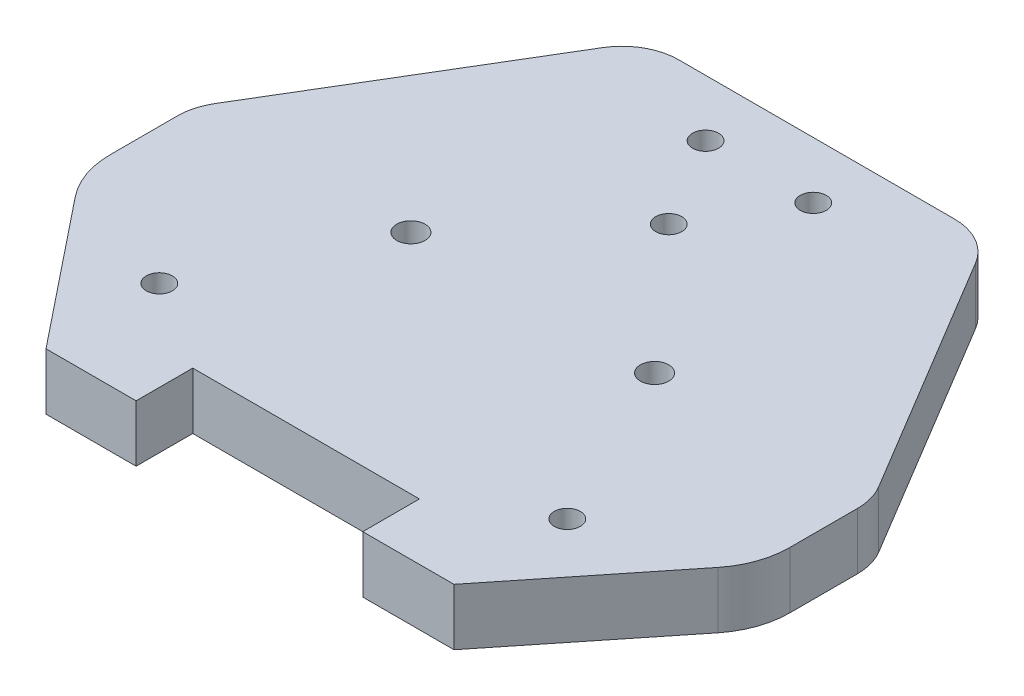
ISO-10303-21;
HEADER;
FILE_DESCRIPTION(('STEP AP214'),'2;1');
FILE_NAME('part.step','',(''),(''),'','','');
FILE_SCHEMA(('AUTOMOTIVE_DESIGN { 1 0 10303 214 1 1 1 1 }'));
ENDSEC;
DATA;
#1=APPLICATION_CONTEXT('core data for automotive mechanical design processes');
#2=APPLICATION_PROTOCOL_DEFINITION('international standard','automotive_design',2000,#1);
#3=PRODUCT_CONTEXT('',#1,'mechanical');
#4=PRODUCT('Part','Part','',(#3));
#5=PRODUCT_RELATED_PRODUCT_CATEGORY('part','',(#4));
#6=PRODUCT_DEFINITION_FORMATION('','',#4);
#7=PRODUCT_DEFINITION_CONTEXT('part definition',#1,'design');
#8=PRODUCT_DEFINITION('design','',#6,#7);
#9=PRODUCT_DEFINITION_SHAPE('','',#8);
#10=(LENGTH_UNIT() NAMED_UNIT(*) SI_UNIT(.MILLI.,.METRE.));
#11=(NAMED_UNIT(*) PLANE_ANGLE_UNIT() SI_UNIT($,.RADIAN.));
#12=(NAMED_UNIT(*) SI_UNIT($,.STERADIAN.) SOLID_ANGLE_UNIT());
#13=UNCERTAINTY_MEASURE_WITH_UNIT(LENGTH_MEASURE(1.E-05),#10,'distance_accuracy_value','');
#14=(GEOMETRIC_REPRESENTATION_CONTEXT(3) GLOBAL_UNCERTAINTY_ASSIGNED_CONTEXT((#13)) GLOBAL_UNIT_ASSIGNED_CONTEXT((#10,
#11,#12)) REPRESENTATION_CONTEXT('',''));
#15=CARTESIAN_POINT('',(0.,0.,0.));
#16=DIRECTION('',(0.,0.,1.));
#17=DIRECTION('',(1.,0.,0.));
#18=AXIS2_PLACEMENT_3D('',#15,#16,#17);
#19=CARTESIAN_POINT('',(0.,6.35,0.));
#20=DIRECTION('',(0.,1.,0.));
#21=DIRECTION('',(0.,0.,1.));
#22=AXIS2_PLACEMENT_3D('',#19,#20,#21);
#23=PLANE('',#22);
#24=CARTESIAN_POINT('',(19.685,6.35,-25.4));
#25=DIRECTION('',(0.,1.,0.));
#26=DIRECTION('',(0.,0.,1.));
#27=AXIS2_PLACEMENT_3D('',#24,#25,#26);
#28=CIRCLE('',#27,1.4605);
#29=CARTESIAN_POINT('',(19.685,6.35,-23.9395));
#30=VERTEX_POINT('',#29);
#31=EDGE_CURVE('E183',#30,#30,#28,.F.);
#32=ORIENTED_EDGE('',*,*,#31,.T.);
#33=EDGE_LOOP('',(#32));
#34=FACE_BOUND('',#33,.T.);
#35=CARTESIAN_POINT('',(7.62,6.35,-25.4));
#36=DIRECTION('',(0.,1.,0.));
#37=DIRECTION('',(0.,0.,1.));
#38=AXIS2_PLACEMENT_3D('',#35,#36,#37);
#39=CIRCLE('',#38,1.4605);
#40=CARTESIAN_POINT('',(7.62,6.35,-23.9395));
#41=VERTEX_POINT('',#40);
#42=EDGE_CURVE('E296',#41,#41,#39,.F.);
#43=ORIENTED_EDGE('',*,*,#42,.T.);
#44=EDGE_LOOP('',(#43));
#45=FACE_BOUND('',#44,.T.);
#46=CARTESIAN_POINT('',(13.6525,6.35,-15.24));
#47=DIRECTION('',(0.,1.,0.));
#48=DIRECTION('',(0.,0.,1.));
#49=AXIS2_PLACEMENT_3D('',#46,#47,#48);
#50=CIRCLE('',#49,1.4605);
#51=CARTESIAN_POINT('',(13.6525,6.35,-13.7795));
#52=VERTEX_POINT('',#51);
#53=EDGE_CURVE('E299',#52,#52,#50,.F.);
#54=ORIENTED_EDGE('',*,*,#53,.T.);
#55=EDGE_LOOP('',(#54));
#56=FACE_BOUND('',#55,.T.);
#57=CARTESIAN_POINT('',(-9.144,6.35,19.05));
#58=DIRECTION('',(0.,1.,0.));
#59=DIRECTION('',(0.,0.,1.));
#60=AXIS2_PLACEMENT_3D('',#57,#58,#59);
#61=CIRCLE('',#60,1.4605);
#62=CARTESIAN_POINT('',(-9.144,6.35,20.5105));
#63=VERTEX_POINT('',#62);
#64=EDGE_CURVE('E302',#63,#63,#61,.F.);
#65=ORIENTED_EDGE('',*,*,#64,.T.);
#66=EDGE_LOOP('',(#65));
#67=FACE_BOUND('',#66,.T.);
#68=CARTESIAN_POINT('',(36.576,6.35,19.05));
#69=DIRECTION('',(0.,1.,0.));
#70=DIRECTION('',(0.,0.,1.));
#71=AXIS2_PLACEMENT_3D('',#68,#69,#70);
#72=CIRCLE('',#71,1.4605);
#73=CARTESIAN_POINT('',(36.576,6.35,20.5105));
#74=VERTEX_POINT('',#73);
#75=EDGE_CURVE('E305',#74,#74,#72,.F.);
#76=ORIENTED_EDGE('',*,*,#75,.T.);
#77=EDGE_LOOP('',(#76));
#78=FACE_BOUND('',#77,.T.);
#79=CARTESIAN_POINT('',(27.305,6.35,0.));
#80=DIRECTION('',(0.,1.,0.));
#81=DIRECTION('',(0.,0.,1.));
#82=AXIS2_PLACEMENT_3D('',#79,#80,#81);
#83=CIRCLE('',#82,1.5875);
#84=CARTESIAN_POINT('',(27.305,6.35,1.5875));
#85=VERTEX_POINT('',#84);
#86=EDGE_CURVE('E308',#85,#85,#83,.F.);
#87=ORIENTED_EDGE('',*,*,#86,.T.);
#88=EDGE_LOOP('',(#87));
#89=FACE_BOUND('',#88,.T.);
#90=CARTESIAN_POINT('',(0.,6.35,0.));
#91=DIRECTION('',(0.,1.,0.));
#92=DIRECTION('',(0.,0.,1.));
#93=AXIS2_PLACEMENT_3D('',#90,#91,#92);
#94=CIRCLE('',#93,1.5875);
#95=CARTESIAN_POINT('',(0.,6.35,1.5875));
#96=VERTEX_POINT('',#95);
#97=EDGE_CURVE('E189',#96,#96,#94,.F.);
#98=ORIENTED_EDGE('',*,*,#97,.T.);
#99=EDGE_LOOP('',(#98));
#100=FACE_BOUND('',#99,.T.);
#101=DIRECTION('',(-1.,0.,0.));
#102=VECTOR('',#101,1.);
#103=CARTESIAN_POINT('',(26.3525,6.35,25.4));
#104=LINE('',#103,#102);
#105=CARTESIAN_POINT('',(0.952499999999997,6.35,25.4));
#106=VERTEX_POINT('',#105);
#107=CARTESIAN_POINT('',(26.3525,6.35,25.4));
#108=VERTEX_POINT('',#107);
#109=EDGE_CURVE('E190',#106,#108,#104,.F.);
#110=ORIENTED_EDGE('',*,*,#109,.T.);
#111=DIRECTION('',(0.,0.,-1.));
#112=VECTOR('',#111,1.);
#113=CARTESIAN_POINT('',(26.3525,6.35,31.75));
#114=LINE('',#113,#112);
#115=CARTESIAN_POINT('',(26.3525,6.35,31.75));
#116=VERTEX_POINT('',#115);
#117=EDGE_CURVE('E199',#108,#116,#114,.F.);
#118=ORIENTED_EDGE('',*,*,#117,.T.);
#119=DIRECTION('',(1.,0.,0.));
#120=VECTOR('',#119,1.);
#121=CARTESIAN_POINT('',(-9.144,6.35,31.75));
#122=LINE('',#121,#120);
#123=CARTESIAN_POINT('',(36.576,6.35,31.75));
#124=VERTEX_POINT('',#123);
#125=EDGE_CURVE('E155',#124,#116,#122,.F.);
#126=ORIENTED_EDGE('',*,*,#125,.F.);
#127=DIRECTION('',(0.624695047554424,0.,-0.78086880944303));
#128=VECTOR('',#127,1.);
#129=CARTESIAN_POINT('',(36.576,6.35,31.75));
#130=LINE('',#129,#128);
#131=CARTESIAN_POINT('',(49.7287754099449,6.35,15.3090307375689));
#132=VERTEX_POINT('',#131);
#133=EDGE_CURVE('E152',#132,#124,#130,.F.);
#134=ORIENTED_EDGE('',*,*,#133,.F.);
#135=CARTESIAN_POINT('',(42.291,6.35,9.35881040961303));
#136=DIRECTION('',(0.,-1.,0.));
#137=DIRECTION('',(0.,0.,-1.));
#138=AXIS2_PLACEMENT_3D('',#135,#136,#137);
#139=CIRCLE('',#138,9.525);
#140=CARTESIAN_POINT('',(51.816,6.35,9.35881040961303));
#141=VERTEX_POINT('',#140);
#142=EDGE_CURVE('E19',#141,#132,#139,.T.);
#143=ORIENTED_EDGE('',*,*,#142,.F.);
#144=DIRECTION('',(0.,0.,-1.));
#145=VECTOR('',#144,1.);
#146=CARTESIAN_POINT('',(51.816,6.35,12.7));
#147=LINE('',#146,#145);
#148=CARTESIAN_POINT('',(51.816,6.35,1.75884817742255));
#149=VERTEX_POINT('',#148);
#150=EDGE_CURVE('E137',#149,#141,#147,.F.);
#151=ORIENTED_EDGE('',*,*,#150,.F.);
#152=CARTESIAN_POINT('',(45.466,6.35,1.75884817742255));
#153=DIRECTION('',(0.,1.,0.));
#154=DIRECTION('',(0.,0.,1.));
#155=AXIS2_PLACEMENT_3D('',#152,#153,#154);
#156=CIRCLE('',#155,6.35);
#157=CARTESIAN_POINT('',(50.9110800782747,6.35,-1.50819986954225));
#158=VERTEX_POINT('',#157);
#159=EDGE_CURVE('E248',#158,#149,#156,.F.);
#160=ORIENTED_EDGE('',*,*,#159,.F.);
#161=DIRECTION('',(-0.514495755427526,0.,-0.857492925712544));
#162=VECTOR('',#161,1.);
#163=CARTESIAN_POINT('',(42.291,6.35,-15.875));
#164=LINE('',#163,#162);
#165=CARTESIAN_POINT('',(34.6157711718211,6.35,-28.6670480469648));
#166=VERTEX_POINT('',#165);
#167=EDGE_CURVE('E246',#166,#158,#164,.F.);
#168=ORIENTED_EDGE('',*,*,#167,.F.);
#169=CARTESIAN_POINT('',(29.1706910935465,6.35,-25.4));
#170=DIRECTION('',(0.,-1.,0.));
#171=DIRECTION('',(0.,0.,-1.));
#172=AXIS2_PLACEMENT_3D('',#169,#170,#171);
#173=CIRCLE('',#172,6.35);
#174=CARTESIAN_POINT('',(29.1706910935465,6.35,-31.75));
#175=VERTEX_POINT('',#174);
#176=EDGE_CURVE('E320',#175,#166,#173,.T.);
#177=ORIENTED_EDGE('',*,*,#176,.F.);
#178=DIRECTION('',(-1.,0.,0.));
#179=VECTOR('',#178,1.);
#180=CARTESIAN_POINT('',(51.816,6.35,-31.75));
#181=LINE('',#180,#179);
#182=CARTESIAN_POINT('',(-1.73869109354647,6.35,-31.75));
#183=VERTEX_POINT('',#182);
#184=EDGE_CURVE('E242',#183,#175,#181,.F.);
#185=ORIENTED_EDGE('',*,*,#184,.F.);
#186=CARTESIAN_POINT('',(-1.73869109354647,6.35,-25.4));
#187=DIRECTION('',(0.,1.,0.));
#188=DIRECTION('',(0.,0.,1.));
#189=AXIS2_PLACEMENT_3D('',#186,#187,#188);
#190=CIRCLE('',#189,6.35);
#191=CARTESIAN_POINT('',(-7.18377117182112,6.35,-28.6670480469648));
#192=VERTEX_POINT('',#191);
#193=EDGE_CURVE('E241',#192,#183,#190,.F.);
#194=ORIENTED_EDGE('',*,*,#193,.F.);
#195=DIRECTION('',(-0.514495755427527,0.,0.857492925712544));
#196=VECTOR('',#195,1.);
#197=CARTESIAN_POINT('',(-14.859,6.35,-15.875));
#198=LINE('',#197,#196);
#199=CARTESIAN_POINT('',(-23.4790800782747,6.35,-1.50819986954224));
#200=VERTEX_POINT('',#199);
#201=EDGE_CURVE('E238',#200,#192,#198,.F.);
#202=ORIENTED_EDGE('',*,*,#201,.F.);
#203=CARTESIAN_POINT('',(-18.034,6.35,1.75884817742255));
#204=DIRECTION('',(0.,-1.,0.));
#205=DIRECTION('',(0.,0.,-1.));
#206=AXIS2_PLACEMENT_3D('',#203,#204,#205);
#207=CIRCLE('',#206,6.35);
#208=CARTESIAN_POINT('',(-24.384,6.35,1.75884817742255));
#209=VERTEX_POINT('',#208);
#210=EDGE_CURVE('E315',#209,#200,#207,.T.);
#211=ORIENTED_EDGE('',*,*,#210,.F.);
#212=DIRECTION('',(0.,0.,1.));
#213=VECTOR('',#212,1.);
#214=CARTESIAN_POINT('',(-24.384,6.35,-31.75));
#215=LINE('',#214,#213);
#216=CARTESIAN_POINT('',(-24.384,6.35,9.31426121507454));
#217=VERTEX_POINT('',#216);
#218=EDGE_CURVE('E234',#217,#209,#215,.F.);
#219=ORIENTED_EDGE('',*,*,#218,.F.);
#220=CARTESIAN_POINT('',(-14.732,6.35,9.31426121507454));
#221=DIRECTION('',(0.,-1.,0.));
#222=DIRECTION('',(0.,0.,-1.));
#223=AXIS2_PLACEMENT_3D('',#220,#221,#222);
#224=CIRCLE('',#223,9.652);
#225=CARTESIAN_POINT('',(-22.2689457487441,6.35,15.3438178140698));
#226=VERTEX_POINT('',#225);
#227=EDGE_CURVE('E313',#226,#217,#224,.T.);
#228=ORIENTED_EDGE('',*,*,#227,.F.);
#229=DIRECTION('',(0.624695047554424,0.,0.78086880944303));
#230=VECTOR('',#229,1.);
#231=CARTESIAN_POINT('',(-24.384,6.35,12.7));
#232=LINE('',#231,#230);
#233=CARTESIAN_POINT('',(-9.144,6.35,31.75));
#234=VERTEX_POINT('',#233);
#235=EDGE_CURVE('E229',#234,#226,#232,.F.);
#236=ORIENTED_EDGE('',*,*,#235,.F.);
#237=DIRECTION('',(1.,0.,0.));
#238=VECTOR('',#237,1.);
#239=CARTESIAN_POINT('',(-9.144,6.35,31.75));
#240=LINE('',#239,#238);
#241=CARTESIAN_POINT('',(0.952499999999999,6.35,31.75));
#242=VERTEX_POINT('',#241);
#243=EDGE_CURVE('E224',#242,#234,#240,.F.);
#244=ORIENTED_EDGE('',*,*,#243,.F.);
#245=DIRECTION('',(0.,0.,1.));
#246=VECTOR('',#245,1.);
#247=CARTESIAN_POINT('',(0.9525,6.35,25.4));
#248=LINE('',#247,#246);
#249=EDGE_CURVE('E207',#242,#106,#248,.F.);
#250=ORIENTED_EDGE('',*,*,#249,.T.);
#251=EDGE_LOOP('',(#110,#118,#126,#134,#143,#151,#160,#168,#177,#185,#194,#202,#211,#219,#228,
#236,#244,#250));
#252=FACE_BOUND('',#251,.T.);
#253=ADVANCED_FACE('F16',(#34,#45,#56,#67,#78,#89,#100,#252),#23,.T.);
#254=CARTESIAN_POINT('',(26.3525,6.35,31.75));
#255=DIRECTION('',(1.,0.,0.));
#256=DIRECTION('',(0.,0.,-1.));
#257=AXIS2_PLACEMENT_3D('',#254,#255,#256);
#258=PLANE('',#257);
#259=ORIENTED_EDGE('',*,*,#117,.F.);
#260=DIRECTION('',(0.,1.,0.));
#261=VECTOR('',#260,1.);
#262=CARTESIAN_POINT('',(26.3525,6.35,25.4));
#263=LINE('',#262,#261);
#264=CARTESIAN_POINT('',(26.3525,0.,25.4));
#265=VERTEX_POINT('',#264);
#266=EDGE_CURVE('E186',#108,#265,#263,.F.);
#267=ORIENTED_EDGE('',*,*,#266,.T.);
#268=DIRECTION('',(0.,0.,1.));
#269=VECTOR('',#268,1.);
#270=CARTESIAN_POINT('',(26.3525,0.,0.));
#271=LINE('',#270,#269);
#272=CARTESIAN_POINT('',(26.3525,0.,31.75));
#273=VERTEX_POINT('',#272);
#274=EDGE_CURVE('E175',#265,#273,#271,.T.);
#275=ORIENTED_EDGE('',*,*,#274,.T.);
#276=DIRECTION('',(0.,1.,0.));
#277=VECTOR('',#276,1.);
#278=CARTESIAN_POINT('',(26.3525,0.,31.75));
#279=LINE('',#278,#277);
#280=EDGE_CURVE('E158',#116,#273,#279,.F.);
#281=ORIENTED_EDGE('',*,*,#280,.F.);
#282=EDGE_LOOP('',(#259,#267,#275,#281));
#283=FACE_BOUND('',#282,.T.);
#284=ADVANCED_FACE('F636',(#283),#258,.F.);
#285=CARTESIAN_POINT('',(-9.144,0.,31.75));
#286=DIRECTION('',(0.,0.,1.));
#287=DIRECTION('',(1.,0.,0.));
#288=AXIS2_PLACEMENT_3D('',#285,#286,#287);
#289=PLANE('',#288);
#290=ORIENTED_EDGE('',*,*,#125,.T.);
#291=ORIENTED_EDGE('',*,*,#280,.T.);
#292=DIRECTION('',(1.,0.,0.));
#293=VECTOR('',#292,1.);
#294=CARTESIAN_POINT('',(0.,0.,31.75));
#295=LINE('',#294,#293);
#296=CARTESIAN_POINT('',(36.576,0.,31.75));
#297=VERTEX_POINT('',#296);
#298=EDGE_CURVE('E172',#273,#297,#295,.T.);
#299=ORIENTED_EDGE('',*,*,#298,.T.);
#300=DIRECTION('',(0.,1.,0.));
#301=VECTOR('',#300,1.);
#302=CARTESIAN_POINT('',(36.576,0.,31.75));
#303=LINE('',#302,#301);
#304=EDGE_CURVE('E150',#124,#297,#303,.F.);
#305=ORIENTED_EDGE('',*,*,#304,.F.);
#306=EDGE_LOOP('',(#290,#291,#299,#305));
#307=FACE_BOUND('',#306,.T.);
#308=ADVANCED_FACE('F628',(#307),#289,.T.);
#309=CARTESIAN_POINT('',(36.576,0.,31.75));
#310=DIRECTION('',(0.78086880944303,0.,0.624695047554424));
#311=DIRECTION('',(0.624695047554424,0.,-0.78086880944303));
#312=AXIS2_PLACEMENT_3D('',#309,#310,#311);
#313=PLANE('',#312);
#314=DIRECTION('',(0.624695047554425,0.,-0.78086880944303));
#315=VECTOR('',#314,1.);
#316=CARTESIAN_POINT('',(36.576,0.,31.75));
#317=LINE('',#316,#315);
#318=CARTESIAN_POINT('',(49.7287754099449,0.,15.3090307375689));
#319=VERTEX_POINT('',#318);
#320=EDGE_CURVE('E163',#297,#319,#317,.T.);
#321=ORIENTED_EDGE('',*,*,#320,.T.);
#322=DIRECTION('',(0.,-1.,0.));
#323=VECTOR('',#322,1.);
#324=CARTESIAN_POINT('',(49.7287754099449,18.44548,15.3090307375689));
#325=LINE('',#324,#323);
#326=EDGE_CURVE('E146',#132,#319,#325,.T.);
#327=ORIENTED_EDGE('',*,*,#326,.F.);
#328=ORIENTED_EDGE('',*,*,#133,.T.);
#329=ORIENTED_EDGE('',*,*,#304,.T.);
#330=EDGE_LOOP('',(#321,#327,#328,#329));
#331=FACE_BOUND('',#330,.T.);
#332=ADVANCED_FACE('F161',(#331),#313,.T.);
#333=CARTESIAN_POINT('',(42.291,18.44548,9.35881040961303));
#334=DIRECTION('',(0.,-1.,0.));
#335=DIRECTION('',(0.,0.,-1.));
#336=AXIS2_PLACEMENT_3D('',#333,#334,#335);
#337=CYLINDRICAL_SURFACE('',#336,9.525);
#338=ORIENTED_EDGE('',*,*,#326,.T.);
#339=CARTESIAN_POINT('',(42.291,0.,9.35881040961303));
#340=DIRECTION('',(0.,-1.,0.));
#341=DIRECTION('',(0.,0.,-1.));
#342=AXIS2_PLACEMENT_3D('',#339,#340,#341);
#343=CIRCLE('',#342,9.525);
#344=CARTESIAN_POINT('',(51.816,0.,9.35881040961303));
#345=VERTEX_POINT('',#344);
#346=EDGE_CURVE('E292',#319,#345,#343,.F.);
#347=ORIENTED_EDGE('',*,*,#346,.T.);
#348=DIRECTION('',(0.,1.,0.));
#349=VECTOR('',#348,1.);
#350=CARTESIAN_POINT('',(51.816,0.,9.35881040961303));
#351=LINE('',#350,#349);
#352=EDGE_CURVE('E148',#141,#345,#351,.F.);
#353=ORIENTED_EDGE('',*,*,#352,.F.);
#354=ORIENTED_EDGE('',*,*,#142,.T.);
#355=EDGE_LOOP('',(#338,#347,#353,#354));
#356=FACE_BOUND('',#355,.T.);
#357=ADVANCED_FACE('F143',(#356),#337,.T.);
#358=CARTESIAN_POINT('',(51.816,0.,12.7));
#359=DIRECTION('',(1.,0.,0.));
#360=DIRECTION('',(0.,0.,-1.));
#361=AXIS2_PLACEMENT_3D('',#358,#359,#360);
#362=PLANE('',#361);
#363=DIRECTION('',(0.,0.,1.));
#364=VECTOR('',#363,1.);
#365=CARTESIAN_POINT('',(51.816,0.,0.));
#366=LINE('',#365,#364);
#367=CARTESIAN_POINT('',(51.816,0.,1.75884817742255));
#368=VERTEX_POINT('',#367);
#369=EDGE_CURVE('E291',#345,#368,#366,.F.);
#370=ORIENTED_EDGE('',*,*,#369,.T.);
#371=DIRECTION('',(0.,1.,0.));
#372=VECTOR('',#371,1.);
#373=CARTESIAN_POINT('',(51.816,-8.27786000000008,1.75884817742255));
#374=LINE('',#373,#372);
#375=EDGE_CURVE('E322',#149,#368,#374,.F.);
#376=ORIENTED_EDGE('',*,*,#375,.F.);
#377=ORIENTED_EDGE('',*,*,#150,.T.);
#378=ORIENTED_EDGE('',*,*,#352,.T.);
#379=EDGE_LOOP('',(#370,#376,#377,#378));
#380=FACE_BOUND('',#379,.T.);
#381=ADVANCED_FACE('F410',(#380),#362,.T.);
#382=CARTESIAN_POINT('',(45.466,-8.27786000000008,1.75884817742255));
#383=DIRECTION('',(0.,1.,0.));
#384=DIRECTION('',(0.,0.,1.));
#385=AXIS2_PLACEMENT_3D('',#382,#383,#384);
#386=CYLINDRICAL_SURFACE('',#385,6.35);
#387=DIRECTION('',(0.,1.,0.));
#388=VECTOR('',#387,1.);
#389=CARTESIAN_POINT('',(50.9110800782747,3.17499999999994,-1.50819986954225));
#390=LINE('',#389,#388);
#391=CARTESIAN_POINT('',(50.9110800782747,0.,-1.50819986954224));
#392=VERTEX_POINT('',#391);
#393=EDGE_CURVE('E247',#158,#392,#390,.F.);
#394=ORIENTED_EDGE('',*,*,#393,.F.);
#395=ORIENTED_EDGE('',*,*,#159,.T.);
#396=ORIENTED_EDGE('',*,*,#375,.T.);
#397=CARTESIAN_POINT('',(45.466,0.,1.75884817742255));
#398=DIRECTION('',(0.,1.,0.));
#399=DIRECTION('',(0.,0.,1.));
#400=AXIS2_PLACEMENT_3D('',#397,#398,#399);
#401=CIRCLE('',#400,6.35);
#402=EDGE_CURVE('E288',#368,#392,#401,.T.);
#403=ORIENTED_EDGE('',*,*,#402,.T.);
#404=EDGE_LOOP('',(#394,#395,#396,#403));
#405=FACE_BOUND('',#404,.T.);
#406=ADVANCED_FACE('F408',(#405),#386,.T.);
#407=CARTESIAN_POINT('',(42.291,3.17499999999994,-15.875));
#408=DIRECTION('',(0.857492925712544,0.,-0.514495755427526));
#409=DIRECTION('',(-0.514495755427526,0.,-0.857492925712544));
#410=AXIS2_PLACEMENT_3D('',#407,#408,#409);
#411=PLANE('',#410);
#412=DIRECTION('',(-0.514495755427526,0.,-0.857492925712544));
#413=VECTOR('',#412,1.);
#414=CARTESIAN_POINT('',(50.9110800782747,0.,-1.50819986954224));
#415=LINE('',#414,#413);
#416=CARTESIAN_POINT('',(34.6157711718211,0.,-28.6670480469648));
#417=VERTEX_POINT('',#416);
#418=EDGE_CURVE('E287',#392,#417,#415,.T.);
#419=ORIENTED_EDGE('',*,*,#418,.T.);
#420=DIRECTION('',(0.,-1.,0.));
#421=VECTOR('',#420,1.);
#422=CARTESIAN_POINT('',(34.6157711718211,14.6278600000001,-28.6670480469648));
#423=LINE('',#422,#421);
#424=EDGE_CURVE('E245',#166,#417,#423,.T.);
#425=ORIENTED_EDGE('',*,*,#424,.F.);
#426=ORIENTED_EDGE('',*,*,#167,.T.);
#427=ORIENTED_EDGE('',*,*,#393,.T.);
#428=EDGE_LOOP('',(#419,#425,#426,#427));
#429=FACE_BOUND('',#428,.T.);
#430=ADVANCED_FACE('F406',(#429),#411,.T.);
#431=CARTESIAN_POINT('',(29.1706910935465,14.6278600000001,-25.4));
#432=DIRECTION('',(0.,-1.,0.));
#433=DIRECTION('',(0.,0.,-1.));
#434=AXIS2_PLACEMENT_3D('',#431,#432,#433);
#435=CYLINDRICAL_SURFACE('',#434,6.35);
#436=ORIENTED_EDGE('',*,*,#424,.T.);
#437=CARTESIAN_POINT('',(29.1706910935465,0.,-25.4));
#438=DIRECTION('',(0.,-1.,0.));
#439=DIRECTION('',(0.,0.,-1.));
#440=AXIS2_PLACEMENT_3D('',#437,#438,#439);
#441=CIRCLE('',#440,6.35);
#442=CARTESIAN_POINT('',(29.1706910935465,0.,-31.75));
#443=VERTEX_POINT('',#442);
#444=EDGE_CURVE('E284',#417,#443,#441,.F.);
#445=ORIENTED_EDGE('',*,*,#444,.T.);
#446=DIRECTION('',(0.,1.,0.));
#447=VECTOR('',#446,1.);
#448=CARTESIAN_POINT('',(29.1706910935465,0.,-31.75));
#449=LINE('',#448,#447);
#450=EDGE_CURVE('E244',#175,#443,#449,.F.);
#451=ORIENTED_EDGE('',*,*,#450,.F.);
#452=ORIENTED_EDGE('',*,*,#176,.T.);
#453=EDGE_LOOP('',(#436,#445,#451,#452));
#454=FACE_BOUND('',#453,.T.);
#455=ADVANCED_FACE('F402',(#454),#435,.T.);
#456=CARTESIAN_POINT('',(51.816,0.,-31.75));
#457=DIRECTION('',(0.,0.,-1.));
#458=DIRECTION('',(-1.,0.,0.));
#459=AXIS2_PLACEMENT_3D('',#456,#457,#458);
#460=PLANE('',#459);
#461=DIRECTION('',(1.,0.,0.));
#462=VECTOR('',#461,1.);
#463=CARTESIAN_POINT('',(0.,0.,-31.75));
#464=LINE('',#463,#462);
#465=CARTESIAN_POINT('',(-1.73869109354647,0.,-31.75));
#466=VERTEX_POINT('',#465);
#467=EDGE_CURVE('E283',#443,#466,#464,.F.);
#468=ORIENTED_EDGE('',*,*,#467,.T.);
#469=DIRECTION('',(0.,1.,0.));
#470=VECTOR('',#469,1.);
#471=CARTESIAN_POINT('',(-1.73869109354647,-8.27786000000008,-31.75));
#472=LINE('',#471,#470);
#473=EDGE_CURVE('E319',#183,#466,#472,.F.);
#474=ORIENTED_EDGE('',*,*,#473,.F.);
#475=ORIENTED_EDGE('',*,*,#184,.T.);
#476=ORIENTED_EDGE('',*,*,#450,.T.);
#477=EDGE_LOOP('',(#468,#474,#475,#476));
#478=FACE_BOUND('',#477,.T.);
#479=ADVANCED_FACE('F396',(#478),#460,.T.);
#480=CARTESIAN_POINT('',(-1.73869109354647,-8.27786000000008,-25.4));
#481=DIRECTION('',(0.,1.,0.));
#482=DIRECTION('',(0.,0.,1.));
#483=AXIS2_PLACEMENT_3D('',#480,#481,#482);
#484=CYLINDRICAL_SURFACE('',#483,6.35);
#485=DIRECTION('',(0.,1.,0.));
#486=VECTOR('',#485,1.);
#487=CARTESIAN_POINT('',(-7.18377117182112,3.17500000000002,-28.6670480469648));
#488=LINE('',#487,#486);
#489=CARTESIAN_POINT('',(-7.18377117182113,0.,-28.6670480469648));
#490=VERTEX_POINT('',#489);
#491=EDGE_CURVE('E240',#192,#490,#488,.F.);
#492=ORIENTED_EDGE('',*,*,#491,.F.);
#493=ORIENTED_EDGE('',*,*,#193,.T.);
#494=ORIENTED_EDGE('',*,*,#473,.T.);
#495=CARTESIAN_POINT('',(-1.73869109354647,0.,-25.4));
#496=DIRECTION('',(0.,1.,0.));
#497=DIRECTION('',(0.,0.,1.));
#498=AXIS2_PLACEMENT_3D('',#495,#496,#497);
#499=CIRCLE('',#498,6.35);
#500=EDGE_CURVE('E280',#466,#490,#499,.T.);
#501=ORIENTED_EDGE('',*,*,#500,.T.);
#502=EDGE_LOOP('',(#492,#493,#494,#501));
#503=FACE_BOUND('',#502,.T.);
#504=ADVANCED_FACE('F393',(#503),#484,.T.);
#505=CARTESIAN_POINT('',(-14.859,3.17500000000002,-15.875));
#506=DIRECTION('',(-0.857492925712544,0.,-0.514495755427527));
#507=DIRECTION('',(-0.514495755427527,0.,0.857492925712544));
#508=AXIS2_PLACEMENT_3D('',#505,#506,#507);
#509=PLANE('',#508);
#510=ORIENTED_EDGE('',*,*,#201,.T.);
#511=ORIENTED_EDGE('',*,*,#491,.T.);
#512=DIRECTION('',(-0.514495755427526,0.,0.857492925712544));
#513=VECTOR('',#512,1.);
#514=CARTESIAN_POINT('',(-7.18377117182114,0.,-28.6670480469648));
#515=LINE('',#514,#513);
#516=CARTESIAN_POINT('',(-23.4790800782747,0.,-1.50819986954224));
#517=VERTEX_POINT('',#516);
#518=EDGE_CURVE('E279',#490,#517,#515,.T.);
#519=ORIENTED_EDGE('',*,*,#518,.T.);
#520=DIRECTION('',(0.,-1.,0.));
#521=VECTOR('',#520,1.);
#522=CARTESIAN_POINT('',(-23.4790800782747,14.6278600000001,-1.50819986954224));
#523=LINE('',#522,#521);
#524=EDGE_CURVE('E237',#200,#517,#523,.T.);
#525=ORIENTED_EDGE('',*,*,#524,.F.);
#526=EDGE_LOOP('',(#510,#511,#519,#525));
#527=FACE_BOUND('',#526,.T.);
#528=ADVANCED_FACE('F387',(#527),#509,.T.);
#529=CARTESIAN_POINT('',(-18.034,14.6278600000001,1.75884817742255));
#530=DIRECTION('',(0.,-1.,0.));
#531=DIRECTION('',(0.,0.,-1.));
#532=AXIS2_PLACEMENT_3D('',#529,#530,#531);
#533=CYLINDRICAL_SURFACE('',#532,6.35);
#534=ORIENTED_EDGE('',*,*,#524,.T.);
#535=CARTESIAN_POINT('',(-18.034,0.,1.75884817742255));
#536=DIRECTION('',(0.,-1.,0.));
#537=DIRECTION('',(0.,0.,-1.));
#538=AXIS2_PLACEMENT_3D('',#535,#536,#537);
#539=CIRCLE('',#538,6.35);
#540=CARTESIAN_POINT('',(-24.384,0.,1.75884817742255));
#541=VERTEX_POINT('',#540);
#542=EDGE_CURVE('E276',#517,#541,#539,.F.);
#543=ORIENTED_EDGE('',*,*,#542,.T.);
#544=DIRECTION('',(0.,1.,0.));
#545=VECTOR('',#544,1.);
#546=CARTESIAN_POINT('',(-24.384,0.,1.75884817742256));
#547=LINE('',#546,#545);
#548=EDGE_CURVE('E236',#209,#541,#547,.F.);
#549=ORIENTED_EDGE('',*,*,#548,.F.);
#550=ORIENTED_EDGE('',*,*,#210,.T.);
#551=EDGE_LOOP('',(#534,#543,#549,#550));
#552=FACE_BOUND('',#551,.T.);
#553=ADVANCED_FACE('F383',(#552),#533,.T.);
#554=CARTESIAN_POINT('',(-24.384,0.,-31.75));
#555=DIRECTION('',(-1.,0.,0.));
#556=DIRECTION('',(0.,0.,1.));
#557=AXIS2_PLACEMENT_3D('',#554,#555,#556);
#558=PLANE('',#557);
#559=ORIENTED_EDGE('',*,*,#218,.T.);
#560=ORIENTED_EDGE('',*,*,#548,.T.);
#561=DIRECTION('',(0.,0.,1.));
#562=VECTOR('',#561,1.);
#563=CARTESIAN_POINT('',(-24.384,0.,0.));
#564=LINE('',#563,#562);
#565=CARTESIAN_POINT('',(-24.384,0.,9.31426121507454));
#566=VERTEX_POINT('',#565);
#567=EDGE_CURVE('E275',#541,#566,#564,.T.);
#568=ORIENTED_EDGE('',*,*,#567,.T.);
#569=DIRECTION('',(0.,-1.,0.));
#570=VECTOR('',#569,1.);
#571=CARTESIAN_POINT('',(-24.384,18.5981848,9.31426121507454));
#572=LINE('',#571,#570);
#573=EDGE_CURVE('E231',#217,#566,#572,.T.);
#574=ORIENTED_EDGE('',*,*,#573,.F.);
#575=EDGE_LOOP('',(#559,#560,#568,#574));
#576=FACE_BOUND('',#575,.T.);
#577=ADVANCED_FACE('F377',(#576),#558,.T.);
#578=CARTESIAN_POINT('',(-14.732,18.5981848,9.31426121507454));
#579=DIRECTION('',(0.,-1.,0.));
#580=DIRECTION('',(0.,0.,-1.));
#581=AXIS2_PLACEMENT_3D('',#578,#579,#580);
#582=CYLINDRICAL_SURFACE('',#581,9.652);
#583=ORIENTED_EDGE('',*,*,#573,.T.);
#584=CARTESIAN_POINT('',(-14.732,0.,9.31426121507454));
#585=DIRECTION('',(0.,-1.,0.));
#586=DIRECTION('',(0.,0.,-1.));
#587=AXIS2_PLACEMENT_3D('',#584,#585,#586);
#588=CIRCLE('',#587,9.652);
#589=CARTESIAN_POINT('',(-22.2689457487441,0.,15.3438178140698));
#590=VERTEX_POINT('',#589);
#591=EDGE_CURVE('E271',#566,#590,#588,.F.);
#592=ORIENTED_EDGE('',*,*,#591,.T.);
#593=DIRECTION('',(0.,1.,0.));
#594=VECTOR('',#593,1.);
#595=CARTESIAN_POINT('',(-22.2689457487441,0.,15.3438178140698));
#596=LINE('',#595,#594);
#597=EDGE_CURVE('E226',#226,#590,#596,.F.);
#598=ORIENTED_EDGE('',*,*,#597,.F.);
#599=ORIENTED_EDGE('',*,*,#227,.T.);
#600=EDGE_LOOP('',(#583,#592,#598,#599));
#601=FACE_BOUND('',#600,.T.);
#602=ADVANCED_FACE('F372',(#601),#582,.T.);
#603=CARTESIAN_POINT('',(-24.384,0.,12.7));
#604=DIRECTION('',(-0.78086880944303,0.,0.624695047554424));
#605=DIRECTION('',(0.624695047554424,0.,0.78086880944303));
#606=AXIS2_PLACEMENT_3D('',#603,#604,#605);
#607=PLANE('',#606);
#608=ORIENTED_EDGE('',*,*,#235,.T.);
#609=ORIENTED_EDGE('',*,*,#597,.T.);
#610=DIRECTION('',(0.624695047554424,0.,0.78086880944303));
#611=VECTOR('',#610,1.);
#612=CARTESIAN_POINT('',(-22.2689457487441,0.,15.3438178140698));
#613=LINE('',#612,#611);
#614=CARTESIAN_POINT('',(-9.144,0.,31.75));
#615=VERTEX_POINT('',#614);
#616=EDGE_CURVE('E274',#590,#615,#613,.T.);
#617=ORIENTED_EDGE('',*,*,#616,.T.);
#618=DIRECTION('',(0.,1.,0.));
#619=VECTOR('',#618,1.);
#620=CARTESIAN_POINT('',(-9.144,0.,31.75));
#621=LINE('',#620,#619);
#622=EDGE_CURVE('E221',#234,#615,#621,.F.);
#623=ORIENTED_EDGE('',*,*,#622,.F.);
#624=EDGE_LOOP('',(#608,#609,#617,#623));
#625=FACE_BOUND('',#624,.T.);
#626=ADVANCED_FACE('F363',(#625),#607,.T.);
#627=CARTESIAN_POINT('',(-9.144,0.,31.75));
#628=DIRECTION('',(0.,0.,1.));
#629=DIRECTION('',(1.,0.,0.));
#630=AXIS2_PLACEMENT_3D('',#627,#628,#629);
#631=PLANE('',#630);
#632=DIRECTION('',(1.,0.,0.));
#633=VECTOR('',#632,1.);
#634=CARTESIAN_POINT('',(0.,0.,31.75));
#635=LINE('',#634,#633);
#636=CARTESIAN_POINT('',(0.9525,0.,31.75));
#637=VERTEX_POINT('',#636);
#638=EDGE_CURVE('E216',#615,#637,#635,.T.);
#639=ORIENTED_EDGE('',*,*,#638,.T.);
#640=DIRECTION('',(0.,1.,0.));
#641=VECTOR('',#640,1.);
#642=CARTESIAN_POINT('',(0.9525,6.35,31.75));
#643=LINE('',#642,#641);
#644=EDGE_CURVE('E211',#637,#242,#643,.T.);
#645=ORIENTED_EDGE('',*,*,#644,.T.);
#646=ORIENTED_EDGE('',*,*,#243,.T.);
#647=ORIENTED_EDGE('',*,*,#622,.T.);
#648=EDGE_LOOP('',(#639,#645,#646,#647));
#649=FACE_BOUND('',#648,.T.);
#650=ADVANCED_FACE('F461',(#649),#631,.T.);
#651=CARTESIAN_POINT('',(0.9525,6.35,25.4));
#652=DIRECTION('',(-1.,0.,0.));
#653=DIRECTION('',(0.,0.,1.));
#654=AXIS2_PLACEMENT_3D('',#651,#652,#653);
#655=PLANE('',#654);
#656=ORIENTED_EDGE('',*,*,#249,.F.);
#657=ORIENTED_EDGE('',*,*,#644,.F.);
#658=DIRECTION('',(0.,0.,1.));
#659=VECTOR('',#658,1.);
#660=CARTESIAN_POINT('',(0.9525,0.,0.));
#661=LINE('',#660,#659);
#662=CARTESIAN_POINT('',(0.952499999999997,0.,25.4));
#663=VERTEX_POINT('',#662);
#664=EDGE_CURVE('E196',#637,#663,#661,.F.);
#665=ORIENTED_EDGE('',*,*,#664,.T.);
#666=DIRECTION('',(0.,1.,0.));
#667=VECTOR('',#666,1.);
#668=CARTESIAN_POINT('',(0.952499999999995,6.35,25.4));
#669=LINE('',#668,#667);
#670=EDGE_CURVE('E34',#663,#106,#669,.T.);
#671=ORIENTED_EDGE('',*,*,#670,.T.);
#672=EDGE_LOOP('',(#656,#657,#665,#671));
#673=FACE_BOUND('',#672,.T.);
#674=ADVANCED_FACE('F458',(#673),#655,.F.);
#675=CARTESIAN_POINT('',(26.3525,6.35,25.4));
#676=DIRECTION('',(0.,0.,-1.));
#677=DIRECTION('',(-1.,0.,0.));
#678=AXIS2_PLACEMENT_3D('',#675,#676,#677);
#679=PLANE('',#678);
#680=ORIENTED_EDGE('',*,*,#109,.F.);
#681=ORIENTED_EDGE('',*,*,#670,.F.);
#682=DIRECTION('',(1.,0.,0.));
#683=VECTOR('',#682,1.);
#684=CARTESIAN_POINT('',(0.,0.,25.4));
#685=LINE('',#684,#683);
#686=EDGE_CURVE('E193',#663,#265,#685,.T.);
#687=ORIENTED_EDGE('',*,*,#686,.T.);
#688=ORIENTED_EDGE('',*,*,#266,.F.);
#689=EDGE_LOOP('',(#680,#681,#687,#688));
#690=FACE_BOUND('',#689,.T.);
#691=ADVANCED_FACE('F454',(#690),#679,.F.);
#692=CARTESIAN_POINT('',(0.,0.,0.));
#693=DIRECTION('',(0.,1.,0.));
#694=DIRECTION('',(0.,0.,1.));
#695=AXIS2_PLACEMENT_3D('',#692,#693,#694);
#696=CYLINDRICAL_SURFACE('',#695,1.5875);
#697=ORIENTED_EDGE('',*,*,#97,.F.);
#698=EDGE_LOOP('',(#697));
#699=FACE_BOUND('',#698,.T.);
#700=CARTESIAN_POINT('',(0.,0.,0.));
#701=DIRECTION('',(0.,1.,0.));
#702=DIRECTION('',(0.,0.,1.));
#703=AXIS2_PLACEMENT_3D('',#700,#701,#702);
#704=CIRCLE('',#703,1.5875);
#705=CARTESIAN_POINT('',(0.,0.,1.5875));
#706=VERTEX_POINT('',#705);
#707=EDGE_CURVE('E195',#706,#706,#704,.F.);
#708=ORIENTED_EDGE('',*,*,#707,.T.);
#709=EDGE_LOOP('',(#708));
#710=FACE_BOUND('',#709,.T.);
#711=ADVANCED_FACE('F450',(#699,#710),#696,.F.);
#712=CARTESIAN_POINT('',(27.305,0.,0.));
#713=DIRECTION('',(0.,1.,0.));
#714=DIRECTION('',(0.,0.,1.));
#715=AXIS2_PLACEMENT_3D('',#712,#713,#714);
#716=CYLINDRICAL_SURFACE('',#715,1.5875);
#717=ORIENTED_EDGE('',*,*,#86,.F.);
#718=EDGE_LOOP('',(#717));
#719=FACE_BOUND('',#718,.T.);
#720=CARTESIAN_POINT('',(27.305,0.,0.));
#721=DIRECTION('',(0.,1.,0.));
#722=DIRECTION('',(0.,0.,1.));
#723=AXIS2_PLACEMENT_3D('',#720,#721,#722);
#724=CIRCLE('',#723,1.5875);
#725=CARTESIAN_POINT('',(27.305,0.,1.5875));
#726=VERTEX_POINT('',#725);
#727=EDGE_CURVE('E266',#726,#726,#724,.F.);
#728=ORIENTED_EDGE('',*,*,#727,.T.);
#729=EDGE_LOOP('',(#728));
#730=FACE_BOUND('',#729,.T.);
#731=ADVANCED_FACE('F446',(#719,#730),#716,.F.);
#732=CARTESIAN_POINT('',(36.576,0.,19.05));
#733=DIRECTION('',(0.,1.,0.));
#734=DIRECTION('',(0.,0.,1.));
#735=AXIS2_PLACEMENT_3D('',#732,#733,#734);
#736=CYLINDRICAL_SURFACE('',#735,1.4605);
#737=ORIENTED_EDGE('',*,*,#75,.F.);
#738=EDGE_LOOP('',(#737));
#739=FACE_BOUND('',#738,.T.);
#740=CARTESIAN_POINT('',(36.576,0.,19.05));
#741=DIRECTION('',(0.,1.,0.));
#742=DIRECTION('',(0.,0.,1.));
#743=AXIS2_PLACEMENT_3D('',#740,#741,#742);
#744=CIRCLE('',#743,1.4605);
#745=CARTESIAN_POINT('',(36.576,0.,20.5105));
#746=VERTEX_POINT('',#745);
#747=EDGE_CURVE('E263',#746,#746,#744,.F.);
#748=ORIENTED_EDGE('',*,*,#747,.T.);
#749=EDGE_LOOP('',(#748));
#750=FACE_BOUND('',#749,.T.);
#751=ADVANCED_FACE('F442',(#739,#750),#736,.F.);
#752=CARTESIAN_POINT('',(-9.144,0.,19.05));
#753=DIRECTION('',(0.,1.,0.));
#754=DIRECTION('',(0.,0.,1.));
#755=AXIS2_PLACEMENT_3D('',#752,#753,#754);
#756=CYLINDRICAL_SURFACE('',#755,1.4605);
#757=ORIENTED_EDGE('',*,*,#64,.F.);
#758=EDGE_LOOP('',(#757));
#759=FACE_BOUND('',#758,.T.);
#760=CARTESIAN_POINT('',(-9.144,0.,19.05));
#761=DIRECTION('',(0.,1.,0.));
#762=DIRECTION('',(0.,0.,1.));
#763=AXIS2_PLACEMENT_3D('',#760,#761,#762);
#764=CIRCLE('',#763,1.4605);
#765=CARTESIAN_POINT('',(-9.144,0.,20.5105));
#766=VERTEX_POINT('',#765);
#767=EDGE_CURVE('E260',#766,#766,#764,.F.);
#768=ORIENTED_EDGE('',*,*,#767,.T.);
#769=EDGE_LOOP('',(#768));
#770=FACE_BOUND('',#769,.T.);
#771=ADVANCED_FACE('F438',(#759,#770),#756,.F.);
#772=CARTESIAN_POINT('',(13.6525,0.,-15.24));
#773=DIRECTION('',(0.,1.,0.));
#774=DIRECTION('',(0.,0.,1.));
#775=AXIS2_PLACEMENT_3D('',#772,#773,#774);
#776=CYLINDRICAL_SURFACE('',#775,1.4605);
#777=ORIENTED_EDGE('',*,*,#53,.F.);
#778=EDGE_LOOP('',(#777));
#779=FACE_BOUND('',#778,.T.);
#780=CARTESIAN_POINT('',(13.6525,0.,-15.24));
#781=DIRECTION('',(0.,1.,0.));
#782=DIRECTION('',(0.,0.,1.));
#783=AXIS2_PLACEMENT_3D('',#780,#781,#782);
#784=CIRCLE('',#783,1.4605);
#785=CARTESIAN_POINT('',(13.6525,0.,-13.7795));
#786=VERTEX_POINT('',#785);
#787=EDGE_CURVE('E257',#786,#786,#784,.F.);
#788=ORIENTED_EDGE('',*,*,#787,.T.);
#789=EDGE_LOOP('',(#788));
#790=FACE_BOUND('',#789,.T.);
#791=ADVANCED_FACE('F434',(#779,#790),#776,.F.);
#792=CARTESIAN_POINT('',(7.62,0.,-25.4));
#793=DIRECTION('',(0.,1.,0.));
#794=DIRECTION('',(0.,0.,1.));
#795=AXIS2_PLACEMENT_3D('',#792,#793,#794);
#796=CYLINDRICAL_SURFACE('',#795,1.4605);
#797=ORIENTED_EDGE('',*,*,#42,.F.);
#798=EDGE_LOOP('',(#797));
#799=FACE_BOUND('',#798,.T.);
#800=CARTESIAN_POINT('',(7.62,0.,-25.4));
#801=DIRECTION('',(0.,1.,0.));
#802=DIRECTION('',(0.,0.,1.));
#803=AXIS2_PLACEMENT_3D('',#800,#801,#802);
#804=CIRCLE('',#803,1.4605);
#805=CARTESIAN_POINT('',(7.62,0.,-23.9395));
#806=VERTEX_POINT('',#805);
#807=EDGE_CURVE('E25',#806,#806,#804,.F.);
#808=ORIENTED_EDGE('',*,*,#807,.T.);
#809=EDGE_LOOP('',(#808));
#810=FACE_BOUND('',#809,.T.);
#811=ADVANCED_FACE('F426',(#799,#810),#796,.F.);
#812=CARTESIAN_POINT('',(19.685,0.,-25.4));
#813=DIRECTION('',(0.,1.,0.));
#814=DIRECTION('',(0.,0.,1.));
#815=AXIS2_PLACEMENT_3D('',#812,#813,#814);
#816=CYLINDRICAL_SURFACE('',#815,1.4605);
#817=ORIENTED_EDGE('',*,*,#31,.F.);
#818=EDGE_LOOP('',(#817));
#819=FACE_BOUND('',#818,.T.);
#820=CARTESIAN_POINT('',(19.685,0.,-25.4));
#821=DIRECTION('',(0.,1.,0.));
#822=DIRECTION('',(0.,0.,1.));
#823=AXIS2_PLACEMENT_3D('',#820,#821,#822);
#824=CIRCLE('',#823,1.4605);
#825=CARTESIAN_POINT('',(19.685,0.,-23.9395));
#826=VERTEX_POINT('',#825);
#827=EDGE_CURVE('E11',#826,#826,#824,.F.);
#828=ORIENTED_EDGE('',*,*,#827,.T.);
#829=EDGE_LOOP('',(#828));
#830=FACE_BOUND('',#829,.T.);
#831=ADVANCED_FACE('F420',(#819,#830),#816,.F.);
#832=CARTESIAN_POINT('',(0.,0.,0.));
#833=DIRECTION('',(0.,1.,0.));
#834=DIRECTION('',(0.,0.,1.));
#835=AXIS2_PLACEMENT_3D('',#832,#833,#834);
#836=PLANE('',#835);
#837=ORIENTED_EDGE('',*,*,#827,.F.);
#838=EDGE_LOOP('',(#837));
#839=FACE_BOUND('',#838,.T.);
#840=ORIENTED_EDGE('',*,*,#807,.F.);
#841=EDGE_LOOP('',(#840));
#842=FACE_BOUND('',#841,.T.);
#843=ORIENTED_EDGE('',*,*,#787,.F.);
#844=EDGE_LOOP('',(#843));
#845=FACE_BOUND('',#844,.T.);
#846=ORIENTED_EDGE('',*,*,#767,.F.);
#847=EDGE_LOOP('',(#846));
#848=FACE_BOUND('',#847,.T.);
#849=ORIENTED_EDGE('',*,*,#747,.F.);
#850=EDGE_LOOP('',(#849));
#851=FACE_BOUND('',#850,.T.);
#852=ORIENTED_EDGE('',*,*,#727,.F.);
#853=EDGE_LOOP('',(#852));
#854=FACE_BOUND('',#853,.T.);
#855=ORIENTED_EDGE('',*,*,#707,.F.);
#856=EDGE_LOOP('',(#855));
#857=FACE_BOUND('',#856,.T.);
#858=ORIENTED_EDGE('',*,*,#664,.F.);
#859=ORIENTED_EDGE('',*,*,#638,.F.);
#860=ORIENTED_EDGE('',*,*,#616,.F.);
#861=ORIENTED_EDGE('',*,*,#591,.F.);
#862=ORIENTED_EDGE('',*,*,#567,.F.);
#863=ORIENTED_EDGE('',*,*,#542,.F.);
#864=ORIENTED_EDGE('',*,*,#518,.F.);
#865=ORIENTED_EDGE('',*,*,#500,.F.);
#866=ORIENTED_EDGE('',*,*,#467,.F.);
#867=ORIENTED_EDGE('',*,*,#444,.F.);
#868=ORIENTED_EDGE('',*,*,#418,.F.);
#869=ORIENTED_EDGE('',*,*,#402,.F.);
#870=ORIENTED_EDGE('',*,*,#369,.F.);
#871=ORIENTED_EDGE('',*,*,#346,.F.);
#872=ORIENTED_EDGE('',*,*,#320,.F.);
#873=ORIENTED_EDGE('',*,*,#298,.F.);
#874=ORIENTED_EDGE('',*,*,#274,.F.);
#875=ORIENTED_EDGE('',*,*,#686,.F.);
#876=EDGE_LOOP('',(#858,#859,#860,#861,#862,#863,#864,#865,#866,#867,#868,#869,#870,#871,#872,
#873,#874,#875));
#877=FACE_BOUND('',#876,.T.);
#878=ADVANCED_FACE('F369',(#839,#842,#845,#848,#851,#854,#857,#877),#836,.F.);
#879=CLOSED_SHELL('',(#253,#284,#308,#332,#357,#381,#406,#430,#455,#479,#504,#528,#553,#577,
#602,#626,#650,#674,#691,#711,#731,#751,#771,#791,#811,#831,#878));
#880=MANIFOLD_SOLID_BREP('B1',#879);
#881=ADVANCED_BREP_SHAPE_REPRESENTATION('',(#18,#880),#14);
#882=SHAPE_DEFINITION_REPRESENTATION(#9,#881);
ENDSEC;
END-ISO-10303-21;
